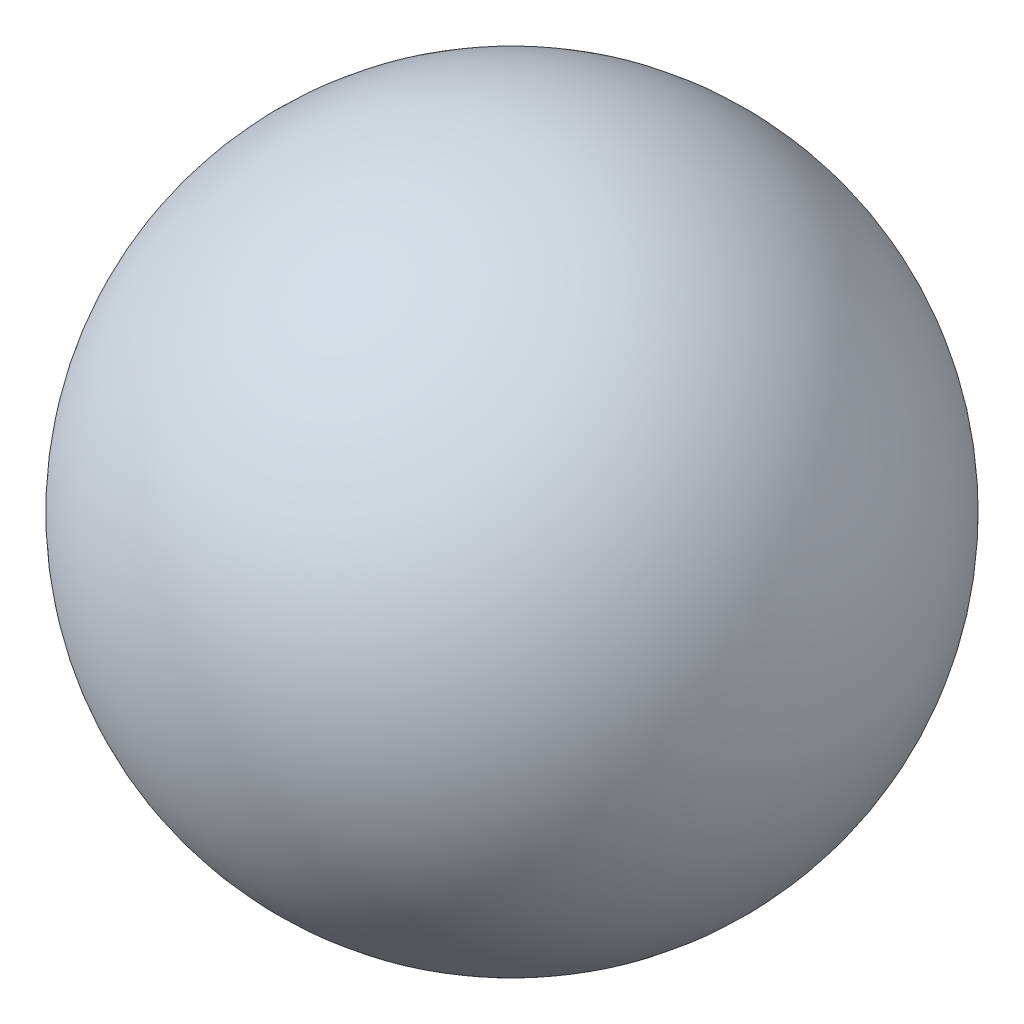
ISO-10303-21;
HEADER;
FILE_DESCRIPTION(('STEP AP214'),'2;1');
FILE_NAME('part.step','',(''),(''),'','','');
FILE_SCHEMA(('AUTOMOTIVE_DESIGN { 1 0 10303 214 1 1 1 1 }'));
ENDSEC;
DATA;
#1=APPLICATION_CONTEXT('core data for automotive mechanical design processes');
#2=APPLICATION_PROTOCOL_DEFINITION('international standard','automotive_design',2000,#1);
#3=PRODUCT_CONTEXT('',#1,'mechanical');
#4=PRODUCT('Part','Part','',(#3));
#5=PRODUCT_RELATED_PRODUCT_CATEGORY('part','',(#4));
#6=PRODUCT_DEFINITION_FORMATION('','',#4);
#7=PRODUCT_DEFINITION_CONTEXT('part definition',#1,'design');
#8=PRODUCT_DEFINITION('design','',#6,#7);
#9=PRODUCT_DEFINITION_SHAPE('','',#8);
#10=(LENGTH_UNIT() NAMED_UNIT(*) SI_UNIT(.MILLI.,.METRE.));
#11=(NAMED_UNIT(*) PLANE_ANGLE_UNIT() SI_UNIT($,.RADIAN.));
#12=(NAMED_UNIT(*) SI_UNIT($,.STERADIAN.) SOLID_ANGLE_UNIT());
#13=UNCERTAINTY_MEASURE_WITH_UNIT(LENGTH_MEASURE(1.E-05),#10,'distance_accuracy_value','');
#14=(GEOMETRIC_REPRESENTATION_CONTEXT(3) GLOBAL_UNCERTAINTY_ASSIGNED_CONTEXT((#13)) GLOBAL_UNIT_ASSIGNED_CONTEXT((#10,
#11,#12)) REPRESENTATION_CONTEXT('',''));
#15=CARTESIAN_POINT('',(0.,0.,0.));
#16=DIRECTION('',(0.,0.,1.));
#17=DIRECTION('',(1.,0.,0.));
#18=AXIS2_PLACEMENT_3D('',#15,#16,#17);
#19=CARTESIAN_POINT('',(0.,0.,0.));
#20=DIRECTION('',(0.,-1.,0.));
#21=DIRECTION('',(-1.,0.,0.));
#22=AXIS2_PLACEMENT_3D('',#19,#20,#21);
#23=SPHERICAL_SURFACE('',#22,76.2);
#24=CARTESIAN_POINT('',(0.,-76.2,0.));
#25=VERTEX_POINT('',#24);
#26=VERTEX_LOOP('',#25);
#27=FACE_BOUND('',#26,.T.);
#28=ADVANCED_FACE('F39',(#27),#23,.T.);
#29=CLOSED_SHELL('',(#28));
#30=MANIFOLD_SOLID_BREP('B2',#29);
#31=ADVANCED_BREP_SHAPE_REPRESENTATION('',(#18,#30),#14);
#32=SHAPE_DEFINITION_REPRESENTATION(#9,#31);
ENDSEC;
END-ISO-10303-21;
